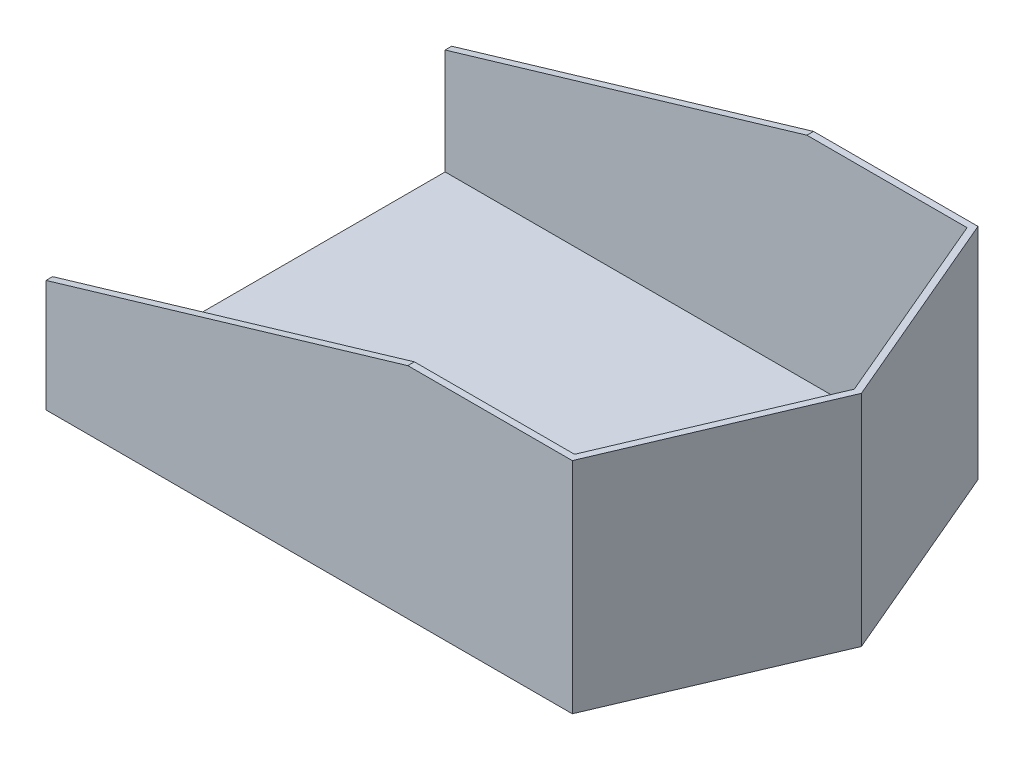
ISO-10303-21;
HEADER;
FILE_DESCRIPTION(('STEP AP214'),'2;1');
FILE_NAME('part.step','',(''),(''),'','','');
FILE_SCHEMA(('AUTOMOTIVE_DESIGN { 1 0 10303 214 1 1 1 1 }'));
ENDSEC;
DATA;
#1=APPLICATION_CONTEXT('core data for automotive mechanical design processes');
#2=APPLICATION_PROTOCOL_DEFINITION('international standard','automotive_design',2000,#1);
#3=PRODUCT_CONTEXT('',#1,'mechanical');
#4=PRODUCT('Part','Part','',(#3));
#5=PRODUCT_RELATED_PRODUCT_CATEGORY('part','',(#4));
#6=PRODUCT_DEFINITION_FORMATION('','',#4);
#7=PRODUCT_DEFINITION_CONTEXT('part definition',#1,'design');
#8=PRODUCT_DEFINITION('design','',#6,#7);
#9=PRODUCT_DEFINITION_SHAPE('','',#8);
#10=(LENGTH_UNIT() NAMED_UNIT(*) SI_UNIT(.MILLI.,.METRE.));
#11=(NAMED_UNIT(*) PLANE_ANGLE_UNIT() SI_UNIT($,.RADIAN.));
#12=(NAMED_UNIT(*) SI_UNIT($,.STERADIAN.) SOLID_ANGLE_UNIT());
#13=UNCERTAINTY_MEASURE_WITH_UNIT(LENGTH_MEASURE(1.E-05),#10,'distance_accuracy_value','');
#14=(GEOMETRIC_REPRESENTATION_CONTEXT(3) GLOBAL_UNCERTAINTY_ASSIGNED_CONTEXT((#13)) GLOBAL_UNIT_ASSIGNED_CONTEXT((#10,
#11,#12)) REPRESENTATION_CONTEXT('',''));
#15=CARTESIAN_POINT('',(0.,0.,0.));
#16=DIRECTION('',(0.,0.,1.));
#17=DIRECTION('',(1.,0.,0.));
#18=AXIS2_PLACEMENT_3D('',#15,#16,#17);
#19=CARTESIAN_POINT('',(0.,100.,0.));
#20=DIRECTION('',(0.,-1.,0.));
#21=DIRECTION('',(0.,0.,-1.));
#22=AXIS2_PLACEMENT_3D('',#19,#20,#21);
#23=PLANE('',#22);
#24=DIRECTION('',(-1.,0.,0.));
#25=VECTOR('',#24,1.);
#26=CARTESIAN_POINT('',(0.,100.,-185.));
#27=LINE('',#26,#25);
#28=CARTESIAN_POINT('',(240.,100.,-185.));
#29=VERTEX_POINT('',#28);
#30=CARTESIAN_POINT('',(164.988073302028,100.,-185.));
#31=VERTEX_POINT('',#30);
#32=EDGE_CURVE('E156',#29,#31,#27,.T.);
#33=ORIENTED_EDGE('',*,*,#32,.T.);
#34=DIRECTION('',(0.,0.,1.));
#35=VECTOR('',#34,1.);
#36=CARTESIAN_POINT('',(164.988073302028,100.,-185.));
#37=LINE('',#36,#35);
#38=CARTESIAN_POINT('',(164.988073302028,100.,-182.));
#39=VERTEX_POINT('',#38);
#40=EDGE_CURVE('E132',#31,#39,#37,.T.);
#41=ORIENTED_EDGE('',*,*,#40,.T.);
#42=DIRECTION('',(-1.,0.,0.));
#43=VECTOR('',#42,1.);
#44=CARTESIAN_POINT('',(0.,100.,-182.));
#45=LINE('',#44,#43);
#46=CARTESIAN_POINT('',(238.015845026663,100.,-182.));
#47=VERTEX_POINT('',#46);
#48=EDGE_CURVE('E200',#47,#39,#45,.T.);
#49=ORIENTED_EDGE('',*,*,#48,.F.);
#50=DIRECTION('',(-0.391371998540612,0.,-0.920232556888924));
#51=VECTOR('',#50,1.);
#52=CARTESIAN_POINT('',(267.106364590007,100.,-113.599492812909));
#53=LINE('',#52,#51);
#54=CARTESIAN_POINT('',(276.079912209642,100.,-92.5));
#55=VERTEX_POINT('',#54);
#56=EDGE_CURVE('E283',#55,#47,#53,.T.);
#57=ORIENTED_EDGE('',*,*,#56,.F.);
#58=DIRECTION('',(0.391371998540612,0.,-0.920232556888924));
#59=VECTOR('',#58,1.);
#60=CARTESIAN_POINT('',(200.478012431332,100.,85.2626651831995));
#61=LINE('',#60,#59);
#62=CARTESIAN_POINT('',(238.015845026663,100.,-3.));
#63=VERTEX_POINT('',#62);
#64=EDGE_CURVE('E282',#63,#55,#61,.T.);
#65=ORIENTED_EDGE('',*,*,#64,.F.);
#66=DIRECTION('',(1.,0.,0.));
#67=VECTOR('',#66,1.);
#68=CARTESIAN_POINT('',(0.,100.,-3.));
#69=LINE('',#68,#67);
#70=CARTESIAN_POINT('',(164.988073302028,100.,-3.));
#71=VERTEX_POINT('',#70);
#72=EDGE_CURVE('E280',#71,#63,#69,.T.);
#73=ORIENTED_EDGE('',*,*,#72,.F.);
#74=CARTESIAN_POINT('',(164.988073302028,100.,0.));
#75=VERTEX_POINT('',#74);
#76=EDGE_CURVE('E58',#71,#75,#37,.T.);
#77=ORIENTED_EDGE('',*,*,#76,.T.);
#78=DIRECTION('',(1.,0.,0.));
#79=VECTOR('',#78,1.);
#80=CARTESIAN_POINT('',(0.,100.,0.));
#81=LINE('',#80,#79);
#82=CARTESIAN_POINT('',(240.,100.,0.));
#83=VERTEX_POINT('',#82);
#84=EDGE_CURVE('E194',#75,#83,#81,.T.);
#85=ORIENTED_EDGE('',*,*,#84,.T.);
#86=DIRECTION('',(0.391371998540612,0.,-0.920232556888924));
#87=VECTOR('',#86,1.);
#88=CARTESIAN_POINT('',(279.339957703079,100.,-92.5));
#89=LINE('',#88,#87);
#90=CARTESIAN_POINT('',(279.339957703079,100.,-92.5));
#91=VERTEX_POINT('',#90);
#92=EDGE_CURVE('E195',#83,#91,#89,.T.);
#93=ORIENTED_EDGE('',*,*,#92,.T.);
#94=DIRECTION('',(-0.391371998540612,0.,-0.920232556888924));
#95=VECTOR('',#94,1.);
#96=CARTESIAN_POINT('',(240.,100.,-185.));
#97=LINE('',#96,#95);
#98=EDGE_CURVE('E160',#91,#29,#97,.T.);
#99=ORIENTED_EDGE('',*,*,#98,.T.);
#100=EDGE_LOOP('',(#33,#41,#49,#57,#65,#73,#77,#85,#93,#99));
#101=FACE_BOUND('',#100,.T.);
#102=ADVANCED_FACE('F43',(#101),#23,.F.);
#103=CARTESIAN_POINT('',(0.,100.,0.));
#104=DIRECTION('',(1.,0.,0.));
#105=DIRECTION('',(0.,0.,-1.));
#106=AXIS2_PLACEMENT_3D('',#103,#104,#105);
#107=PLANE('',#106);
#108=DIRECTION('',(0.,-1.,0.));
#109=VECTOR('',#108,1.);
#110=CARTESIAN_POINT('',(0.,100.,0.));
#111=LINE('',#110,#109);
#112=CARTESIAN_POINT('',(0.,51.1589727194508,0.));
#113=VERTEX_POINT('',#112);
#114=CARTESIAN_POINT('',(0.,0.,0.));
#115=VERTEX_POINT('',#114);
#116=EDGE_CURVE('E51',#113,#115,#111,.T.);
#117=ORIENTED_EDGE('',*,*,#116,.F.);
#118=DIRECTION('',(0.,0.,1.));
#119=VECTOR('',#118,1.);
#120=CARTESIAN_POINT('',(0.,51.1589727194508,-185.));
#121=LINE('',#120,#119);
#122=CARTESIAN_POINT('',(0.,51.1589727194508,-3.));
#123=VERTEX_POINT('',#122);
#124=EDGE_CURVE('E137',#123,#113,#121,.T.);
#125=ORIENTED_EDGE('',*,*,#124,.F.);
#126=DIRECTION('',(0.,1.,0.));
#127=VECTOR('',#126,1.);
#128=CARTESIAN_POINT('',(0.,-176.025137899682,-3.));
#129=LINE('',#128,#127);
#130=CARTESIAN_POINT('',(0.,3.,-3.));
#131=VERTEX_POINT('',#130);
#132=EDGE_CURVE('E263',#131,#123,#129,.T.);
#133=ORIENTED_EDGE('',*,*,#132,.F.);
#134=DIRECTION('',(0.,0.,1.));
#135=VECTOR('',#134,1.);
#136=CARTESIAN_POINT('',(0.,3.,-182.));
#137=LINE('',#136,#135);
#138=CARTESIAN_POINT('',(0.,2.99999999999995,-182.));
#139=VERTEX_POINT('',#138);
#140=EDGE_CURVE('E260',#139,#131,#137,.T.);
#141=ORIENTED_EDGE('',*,*,#140,.F.);
#142=DIRECTION('',(0.,1.,0.));
#143=VECTOR('',#142,1.);
#144=CARTESIAN_POINT('',(0.,-176.025137899682,-182.));
#145=LINE('',#144,#143);
#146=CARTESIAN_POINT('',(0.,51.1589727194507,-182.));
#147=VERTEX_POINT('',#146);
#148=EDGE_CURVE('E148',#139,#147,#145,.T.);
#149=ORIENTED_EDGE('',*,*,#148,.T.);
#150=CARTESIAN_POINT('',(0.,51.1589727194508,-185.));
#151=VERTEX_POINT('',#150);
#152=EDGE_CURVE('E65',#151,#147,#121,.T.);
#153=ORIENTED_EDGE('',*,*,#152,.F.);
#154=DIRECTION('',(0.,-1.,0.));
#155=VECTOR('',#154,1.);
#156=CARTESIAN_POINT('',(0.,100.,-185.));
#157=LINE('',#156,#155);
#158=CARTESIAN_POINT('',(0.,0.,-185.));
#159=VERTEX_POINT('',#158);
#160=EDGE_CURVE('E144',#151,#159,#157,.T.);
#161=ORIENTED_EDGE('',*,*,#160,.T.);
#162=DIRECTION('',(0.,0.,1.));
#163=VECTOR('',#162,1.);
#164=CARTESIAN_POINT('',(0.,0.,0.));
#165=LINE('',#164,#163);
#166=EDGE_CURVE('E180',#159,#115,#165,.T.);
#167=ORIENTED_EDGE('',*,*,#166,.T.);
#168=EDGE_LOOP('',(#117,#125,#133,#141,#149,#153,#161,#167));
#169=FACE_BOUND('',#168,.T.);
#170=ADVANCED_FACE('F45',(#169),#107,.F.);
#171=CARTESIAN_POINT('',(0.,100.,0.));
#172=DIRECTION('',(0.,0.,-1.));
#173=DIRECTION('',(-1.,0.,0.));
#174=AXIS2_PLACEMENT_3D('',#171,#172,#173);
#175=PLANE('',#174);
#176=ORIENTED_EDGE('',*,*,#84,.F.);
#177=DIRECTION('',(0.958868255297712,0.2838514910694,0.));
#178=VECTOR('',#177,1.);
#179=CARTESIAN_POINT('',(0.,51.1589727194508,0.));
#180=LINE('',#179,#178);
#181=EDGE_CURVE('E138',#113,#75,#180,.T.);
#182=ORIENTED_EDGE('',*,*,#181,.F.);
#183=ORIENTED_EDGE('',*,*,#116,.T.);
#184=DIRECTION('',(1.,0.,0.));
#185=VECTOR('',#184,1.);
#186=CARTESIAN_POINT('',(0.,0.,0.));
#187=LINE('',#186,#185);
#188=CARTESIAN_POINT('',(240.,0.,0.));
#189=VERTEX_POINT('',#188);
#190=EDGE_CURVE('E175',#115,#189,#187,.T.);
#191=ORIENTED_EDGE('',*,*,#190,.T.);
#192=DIRECTION('',(0.,-1.,0.));
#193=VECTOR('',#192,1.);
#194=CARTESIAN_POINT('',(240.,100.,0.));
#195=LINE('',#194,#193);
#196=EDGE_CURVE('E167',#83,#189,#195,.T.);
#197=ORIENTED_EDGE('',*,*,#196,.F.);
#198=EDGE_LOOP('',(#176,#182,#183,#191,#197));
#199=FACE_BOUND('',#198,.T.);
#200=ADVANCED_FACE('F173',(#199),#175,.F.);
#201=CARTESIAN_POINT('',(279.339957703079,100.,-92.5));
#202=DIRECTION('',(-0.920232556888924,0.,-0.391371998540612));
#203=DIRECTION('',(-0.391371998540612,0.,0.920232556888924));
#204=AXIS2_PLACEMENT_3D('',#201,#202,#203);
#205=PLANE('',#204);
#206=DIRECTION('',(0.391371998540612,0.,-0.920232556888924));
#207=VECTOR('',#206,1.);
#208=CARTESIAN_POINT('',(279.339957703079,0.,-92.5));
#209=LINE('',#208,#207);
#210=CARTESIAN_POINT('',(279.339957703079,0.,-92.5));
#211=VERTEX_POINT('',#210);
#212=EDGE_CURVE('E182',#189,#211,#209,.T.);
#213=ORIENTED_EDGE('',*,*,#212,.T.);
#214=DIRECTION('',(0.,-1.,0.));
#215=VECTOR('',#214,1.);
#216=CARTESIAN_POINT('',(279.339957703079,100.,-92.5));
#217=LINE('',#216,#215);
#218=EDGE_CURVE('E158',#91,#211,#217,.T.);
#219=ORIENTED_EDGE('',*,*,#218,.F.);
#220=ORIENTED_EDGE('',*,*,#92,.F.);
#221=ORIENTED_EDGE('',*,*,#196,.T.);
#222=EDGE_LOOP('',(#213,#219,#220,#221));
#223=FACE_BOUND('',#222,.T.);
#224=ADVANCED_FACE('F207',(#223),#205,.F.);
#225=CARTESIAN_POINT('',(240.,100.,-185.));
#226=DIRECTION('',(-0.920232556888924,0.,0.391371998540612));
#227=DIRECTION('',(0.391371998540612,0.,0.920232556888924));
#228=AXIS2_PLACEMENT_3D('',#225,#226,#227);
#229=PLANE('',#228);
#230=DIRECTION('',(-0.391371998540612,0.,-0.920232556888924));
#231=VECTOR('',#230,1.);
#232=CARTESIAN_POINT('',(240.,0.,-185.));
#233=LINE('',#232,#231);
#234=CARTESIAN_POINT('',(240.,0.,-185.));
#235=VERTEX_POINT('',#234);
#236=EDGE_CURVE('E191',#211,#235,#233,.T.);
#237=ORIENTED_EDGE('',*,*,#236,.T.);
#238=DIRECTION('',(0.,-1.,0.));
#239=VECTOR('',#238,1.);
#240=CARTESIAN_POINT('',(240.,100.,-185.));
#241=LINE('',#240,#239);
#242=EDGE_CURVE('E155',#29,#235,#241,.T.);
#243=ORIENTED_EDGE('',*,*,#242,.F.);
#244=ORIENTED_EDGE('',*,*,#98,.F.);
#245=ORIENTED_EDGE('',*,*,#218,.T.);
#246=EDGE_LOOP('',(#237,#243,#244,#245));
#247=FACE_BOUND('',#246,.T.);
#248=ADVANCED_FACE('F205',(#247),#229,.F.);
#249=CARTESIAN_POINT('',(0.,100.,-185.));
#250=DIRECTION('',(0.,0.,1.));
#251=DIRECTION('',(1.,0.,0.));
#252=AXIS2_PLACEMENT_3D('',#249,#250,#251);
#253=PLANE('',#252);
#254=ORIENTED_EDGE('',*,*,#160,.F.);
#255=DIRECTION('',(0.958868255297712,0.2838514910694,0.));
#256=VECTOR('',#255,1.);
#257=CARTESIAN_POINT('',(0.,51.1589727194508,-185.));
#258=LINE('',#257,#256);
#259=EDGE_CURVE('E129',#151,#31,#258,.T.);
#260=ORIENTED_EDGE('',*,*,#259,.T.);
#261=ORIENTED_EDGE('',*,*,#32,.F.);
#262=ORIENTED_EDGE('',*,*,#242,.T.);
#263=DIRECTION('',(-1.,0.,0.));
#264=VECTOR('',#263,1.);
#265=CARTESIAN_POINT('',(0.,0.,-185.));
#266=LINE('',#265,#264);
#267=EDGE_CURVE('E153',#235,#159,#266,.T.);
#268=ORIENTED_EDGE('',*,*,#267,.T.);
#269=EDGE_LOOP('',(#254,#260,#261,#262,#268));
#270=FACE_BOUND('',#269,.T.);
#271=ADVANCED_FACE('F150',(#270),#253,.F.);
#272=CARTESIAN_POINT('',(0.,0.,0.));
#273=DIRECTION('',(0.,-1.,0.));
#274=DIRECTION('',(0.,0.,-1.));
#275=AXIS2_PLACEMENT_3D('',#272,#273,#274);
#276=PLANE('',#275);
#277=ORIENTED_EDGE('',*,*,#166,.F.);
#278=ORIENTED_EDGE('',*,*,#267,.F.);
#279=ORIENTED_EDGE('',*,*,#236,.F.);
#280=ORIENTED_EDGE('',*,*,#212,.F.);
#281=ORIENTED_EDGE('',*,*,#190,.F.);
#282=EDGE_LOOP('',(#277,#278,#279,#280,#281));
#283=FACE_BOUND('',#282,.T.);
#284=ADVANCED_FACE('F179',(#283),#276,.T.);
#285=CARTESIAN_POINT('',(0.,100.,-3.));
#286=DIRECTION('',(0.,0.,-1.));
#287=DIRECTION('',(-1.,0.,0.));
#288=AXIS2_PLACEMENT_3D('',#285,#286,#287);
#289=PLANE('',#288);
#290=DIRECTION('',(-0.958868255297712,-0.2838514910694,0.));
#291=VECTOR('',#290,1.);
#292=CARTESIAN_POINT('',(13.293364428122,55.0941758022557,-3.));
#293=LINE('',#292,#291);
#294=EDGE_CURVE('E255',#71,#123,#293,.T.);
#295=ORIENTED_EDGE('',*,*,#294,.F.);
#296=ORIENTED_EDGE('',*,*,#72,.T.);
#297=DIRECTION('',(0.,-1.,0.));
#298=VECTOR('',#297,1.);
#299=CARTESIAN_POINT('',(238.015845026663,100.,-3.00000000000002));
#300=LINE('',#299,#298);
#301=CARTESIAN_POINT('',(238.015845026663,3.,-3.));
#302=VERTEX_POINT('',#301);
#303=EDGE_CURVE('E184',#63,#302,#300,.T.);
#304=ORIENTED_EDGE('',*,*,#303,.T.);
#305=DIRECTION('',(1.,0.,0.));
#306=VECTOR('',#305,1.);
#307=CARTESIAN_POINT('',(0.,3.,-3.));
#308=LINE('',#307,#306);
#309=EDGE_CURVE('E266',#131,#302,#308,.T.);
#310=ORIENTED_EDGE('',*,*,#309,.F.);
#311=ORIENTED_EDGE('',*,*,#132,.T.);
#312=EDGE_LOOP('',(#295,#296,#304,#310,#311));
#313=FACE_BOUND('',#312,.T.);
#314=ADVANCED_FACE('F227',(#313),#289,.T.);
#315=CARTESIAN_POINT('',(276.579260032412,100.,-93.6741159956218));
#316=DIRECTION('',(-0.920232556888924,0.,-0.391371998540612));
#317=DIRECTION('',(-0.391371998540612,0.,0.920232556888924));
#318=AXIS2_PLACEMENT_3D('',#315,#316,#317);
#319=PLANE('',#318);
#320=DIRECTION('',(0.391371998540612,0.,-0.920232556888924));
#321=VECTOR('',#320,1.);
#322=CARTESIAN_POINT('',(200.478012431332,3.,85.2626651831995));
#323=LINE('',#322,#321);
#324=CARTESIAN_POINT('',(276.079912209642,3.,-92.5));
#325=VERTEX_POINT('',#324);
#326=EDGE_CURVE('E268',#302,#325,#323,.T.);
#327=ORIENTED_EDGE('',*,*,#326,.F.);
#328=ORIENTED_EDGE('',*,*,#303,.F.);
#329=ORIENTED_EDGE('',*,*,#64,.T.);
#330=DIRECTION('',(0.,-1.,0.));
#331=VECTOR('',#330,1.);
#332=CARTESIAN_POINT('',(276.079912209642,100.,-92.5));
#333=LINE('',#332,#331);
#334=EDGE_CURVE('E187',#55,#325,#333,.T.);
#335=ORIENTED_EDGE('',*,*,#334,.T.);
#336=EDGE_LOOP('',(#327,#328,#329,#335));
#337=FACE_BOUND('',#336,.T.);
#338=ADVANCED_FACE('F232',(#337),#319,.T.);
#339=CARTESIAN_POINT('',(237.239302329333,100.,-183.825884004378));
#340=DIRECTION('',(-0.920232556888924,0.,0.391371998540612));
#341=DIRECTION('',(0.391371998540612,0.,0.920232556888924));
#342=AXIS2_PLACEMENT_3D('',#339,#340,#341);
#343=PLANE('',#342);
#344=DIRECTION('',(-0.391371998540612,0.,-0.920232556888924));
#345=VECTOR('',#344,1.);
#346=CARTESIAN_POINT('',(267.106364590007,3.,-113.599492812909));
#347=LINE('',#346,#345);
#348=CARTESIAN_POINT('',(238.015845026663,3.,-182.));
#349=VERTEX_POINT('',#348);
#350=EDGE_CURVE('E271',#325,#349,#347,.T.);
#351=ORIENTED_EDGE('',*,*,#350,.F.);
#352=ORIENTED_EDGE('',*,*,#334,.F.);
#353=ORIENTED_EDGE('',*,*,#56,.T.);
#354=DIRECTION('',(0.,-1.,0.));
#355=VECTOR('',#354,1.);
#356=CARTESIAN_POINT('',(238.015845026663,100.,-182.));
#357=LINE('',#356,#355);
#358=EDGE_CURVE('E274',#47,#349,#357,.T.);
#359=ORIENTED_EDGE('',*,*,#358,.T.);
#360=EDGE_LOOP('',(#351,#352,#353,#359));
#361=FACE_BOUND('',#360,.T.);
#362=ADVANCED_FACE('F238',(#361),#343,.T.);
#363=CARTESIAN_POINT('',(0.,100.,-182.));
#364=DIRECTION('',(0.,0.,1.));
#365=DIRECTION('',(1.,0.,0.));
#366=AXIS2_PLACEMENT_3D('',#363,#364,#365);
#367=PLANE('',#366);
#368=DIRECTION('',(0.958868255297712,0.2838514910694,0.));
#369=VECTOR('',#368,1.);
#370=CARTESIAN_POINT('',(13.293364428122,55.0941758022557,-182.));
#371=LINE('',#370,#369);
#372=EDGE_CURVE('E11',#147,#39,#371,.T.);
#373=ORIENTED_EDGE('',*,*,#372,.F.);
#374=ORIENTED_EDGE('',*,*,#148,.F.);
#375=DIRECTION('',(-1.,0.,0.));
#376=VECTOR('',#375,1.);
#377=CARTESIAN_POINT('',(0.,3.,-182.));
#378=LINE('',#377,#376);
#379=EDGE_CURVE('E276',#349,#139,#378,.T.);
#380=ORIENTED_EDGE('',*,*,#379,.F.);
#381=ORIENTED_EDGE('',*,*,#358,.F.);
#382=ORIENTED_EDGE('',*,*,#48,.T.);
#383=EDGE_LOOP('',(#373,#374,#380,#381,#382));
#384=FACE_BOUND('',#383,.T.);
#385=ADVANCED_FACE('F244',(#384),#367,.T.);
#386=CARTESIAN_POINT('',(0.,3.,0.));
#387=DIRECTION('',(0.,-1.,0.));
#388=DIRECTION('',(0.,0.,-1.));
#389=AXIS2_PLACEMENT_3D('',#386,#387,#388);
#390=PLANE('',#389);
#391=ORIENTED_EDGE('',*,*,#379,.T.);
#392=ORIENTED_EDGE('',*,*,#140,.T.);
#393=ORIENTED_EDGE('',*,*,#309,.T.);
#394=ORIENTED_EDGE('',*,*,#326,.T.);
#395=ORIENTED_EDGE('',*,*,#350,.T.);
#396=EDGE_LOOP('',(#391,#392,#393,#394,#395));
#397=FACE_BOUND('',#396,.T.);
#398=ADVANCED_FACE('F225',(#397),#390,.F.);
#399=CARTESIAN_POINT('',(0.,51.1589727194508,-185.));
#400=DIRECTION('',(0.2838514910694,-0.958868255297712,0.));
#401=DIRECTION('',(0.958868255297712,0.2838514910694,0.));
#402=AXIS2_PLACEMENT_3D('',#399,#400,#401);
#403=PLANE('',#402);
#404=ORIENTED_EDGE('',*,*,#372,.T.);
#405=ORIENTED_EDGE('',*,*,#40,.F.);
#406=ORIENTED_EDGE('',*,*,#259,.F.);
#407=ORIENTED_EDGE('',*,*,#152,.T.);
#408=EDGE_LOOP('',(#404,#405,#406,#407));
#409=FACE_BOUND('',#408,.T.);
#410=ADVANCED_FACE('F130',(#409),#403,.F.);
#411=ORIENTED_EDGE('',*,*,#294,.T.);
#412=ORIENTED_EDGE('',*,*,#124,.T.);
#413=ORIENTED_EDGE('',*,*,#181,.T.);
#414=ORIENTED_EDGE('',*,*,#76,.F.);
#415=EDGE_LOOP('',(#411,#412,#413,#414));
#416=FACE_BOUND('',#415,.T.);
#417=ADVANCED_FACE('F292',(#416),#403,.F.);
#418=CLOSED_SHELL('',(#102,#170,#200,#224,#248,#271,#284,#314,#338,#362,#385,#398,#410,#417));
#419=MANIFOLD_SOLID_BREP('B2',#418);
#420=ADVANCED_BREP_SHAPE_REPRESENTATION('',(#18,#419),#14);
#421=SHAPE_DEFINITION_REPRESENTATION(#9,#420);
ENDSEC;
END-ISO-10303-21;
